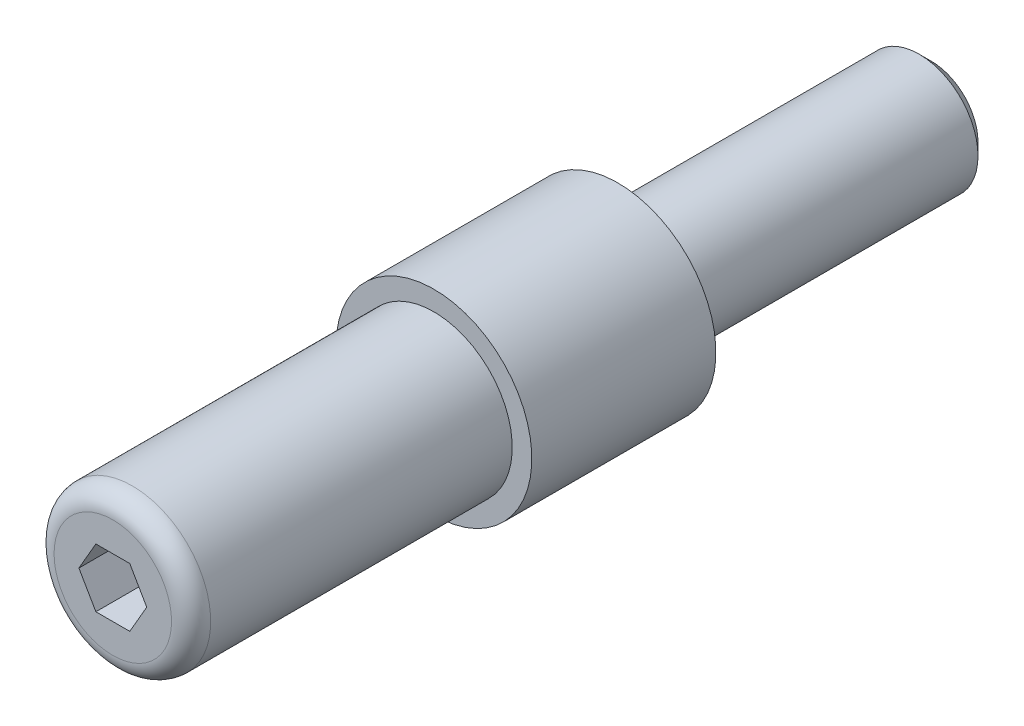
ISO-10303-21;
HEADER;
FILE_DESCRIPTION(('STEP AP214'),'2;1');
FILE_NAME('part.step','',(''),(''),'','','');
FILE_SCHEMA(('AUTOMOTIVE_DESIGN { 1 0 10303 214 1 1 1 1 }'));
ENDSEC;
DATA;
#1=APPLICATION_CONTEXT('core data for automotive mechanical design processes');
#2=APPLICATION_PROTOCOL_DEFINITION('international standard','automotive_design',2000,#1);
#3=PRODUCT_CONTEXT('',#1,'mechanical');
#4=PRODUCT('Part','Part','',(#3));
#5=PRODUCT_RELATED_PRODUCT_CATEGORY('part','',(#4));
#6=PRODUCT_DEFINITION_FORMATION('','',#4);
#7=PRODUCT_DEFINITION_CONTEXT('part definition',#1,'design');
#8=PRODUCT_DEFINITION('design','',#6,#7);
#9=PRODUCT_DEFINITION_SHAPE('','',#8);
#10=(LENGTH_UNIT() NAMED_UNIT(*) SI_UNIT(.MILLI.,.METRE.));
#11=(NAMED_UNIT(*) PLANE_ANGLE_UNIT() SI_UNIT($,.RADIAN.));
#12=(NAMED_UNIT(*) SI_UNIT($,.STERADIAN.) SOLID_ANGLE_UNIT());
#13=UNCERTAINTY_MEASURE_WITH_UNIT(LENGTH_MEASURE(1.E-05),#10,'distance_accuracy_value','');
#14=(GEOMETRIC_REPRESENTATION_CONTEXT(3) GLOBAL_UNCERTAINTY_ASSIGNED_CONTEXT((#13)) GLOBAL_UNIT_ASSIGNED_CONTEXT((#10,
#11,#12)) REPRESENTATION_CONTEXT('',''));
#15=CARTESIAN_POINT('',(0.,0.,0.));
#16=DIRECTION('',(0.,0.,1.));
#17=DIRECTION('',(1.,0.,0.));
#18=AXIS2_PLACEMENT_3D('',#15,#16,#17);
#19=CARTESIAN_POINT('',(0.,-8.80675,-9.));
#20=DIRECTION('',(0.,0.,-1.));
#21=DIRECTION('',(-1.,0.,0.));
#22=AXIS2_PLACEMENT_3D('',#19,#20,#21);
#23=PLANE('',#22);
#24=CARTESIAN_POINT('',(0.,-10.,-9.0000000000714));
#25=DIRECTION('',(0.,0.,1.));
#26=DIRECTION('',(1.,0.,0.));
#27=AXIS2_PLACEMENT_3D('',#24,#25,#26);
#28=CIRCLE('',#27,2.38650000000916);
#29=CARTESIAN_POINT('',(2.38650000000916,-10.,-9.0000000000714));
#30=VERTEX_POINT('',#29);
#31=EDGE_CURVE('E96',#30,#30,#28,.T.);
#32=ORIENTED_EDGE('',*,*,#31,.F.);
#33=EDGE_LOOP('',(#32));
#34=FACE_BOUND('',#33,.T.);
#35=ADVANCED_FACE('F17',(#34),#23,.T.);
#36=CARTESIAN_POINT('',(-1.73205080756888,-10.,35.8));
#37=DIRECTION('',(-0.866025403784439,-0.5,0.));
#38=DIRECTION('',(0.5,-0.866025403784439,0.));
#39=AXIS2_PLACEMENT_3D('',#36,#37,#38);
#40=PLANE('',#39);
#41=DIRECTION('',(0.,0.,-1.));
#42=VECTOR('',#41,1.);
#43=CARTESIAN_POINT('',(-0.866025403784439,-11.5,35.8));
#44=LINE('',#43,#42);
#45=CARTESIAN_POINT('',(-0.86602540378444,-11.5,32.8));
#46=VERTEX_POINT('',#45);
#47=CARTESIAN_POINT('',(-0.86602540378444,-11.5,29.8));
#48=VERTEX_POINT('',#47);
#49=EDGE_CURVE('E93',#46,#48,#44,.T.);
#50=ORIENTED_EDGE('',*,*,#49,.T.);
#51=DIRECTION('',(0.5,-0.866025403784439,0.));
#52=VECTOR('',#51,1.);
#53=CARTESIAN_POINT('',(-1.73205080756888,-10.,29.8));
#54=LINE('',#53,#52);
#55=CARTESIAN_POINT('',(-1.73205080756888,-10.,29.8));
#56=VERTEX_POINT('',#55);
#57=EDGE_CURVE('E82',#56,#48,#54,.T.);
#58=ORIENTED_EDGE('',*,*,#57,.F.);
#59=DIRECTION('',(0.,0.,1.));
#60=VECTOR('',#59,1.);
#61=CARTESIAN_POINT('',(-1.73205080756888,-10.,35.8));
#62=LINE('',#61,#60);
#63=CARTESIAN_POINT('',(-1.73205080756888,-10.,32.8));
#64=VERTEX_POINT('',#63);
#65=EDGE_CURVE('E104',#56,#64,#62,.T.);
#66=ORIENTED_EDGE('',*,*,#65,.T.);
#67=DIRECTION('',(0.5,-0.866025403784439,0.));
#68=VECTOR('',#67,1.);
#69=CARTESIAN_POINT('',(-1.73205080756888,-10.,32.8));
#70=LINE('',#69,#68);
#71=EDGE_CURVE('E77',#46,#64,#70,.F.);
#72=ORIENTED_EDGE('',*,*,#71,.F.);
#73=EDGE_LOOP('',(#50,#58,#66,#72));
#74=FACE_BOUND('',#73,.T.);
#75=ADVANCED_FACE('F94',(#74),#40,.F.);
#76=CARTESIAN_POINT('',(0.,-10.,-8.38649999991503));
#77=DIRECTION('',(0.,0.,1.));
#78=DIRECTION('',(1.,0.,0.));
#79=AXIS2_PLACEMENT_3D('',#76,#77,#78);
#80=CONICAL_SURFACE('',#79,3.00000000010868,0.785398163351121);
#81=CARTESIAN_POINT('',(0.,-10.,-8.3865));
#82=DIRECTION('',(0.,0.,-1.));
#83=DIRECTION('',(-1.,0.,0.));
#84=AXIS2_PLACEMENT_3D('',#81,#82,#83);
#85=CIRCLE('',#84,3.);
#86=CARTESIAN_POINT('',(-3.,-10.,-8.3865));
#87=VERTEX_POINT('',#86);
#88=EDGE_CURVE('E108',#87,#87,#85,.F.);
#89=ORIENTED_EDGE('',*,*,#88,.F.);
#90=EDGE_LOOP('',(#89));
#91=FACE_BOUND('',#90,.T.);
#92=ORIENTED_EDGE('',*,*,#31,.T.);
#93=EDGE_LOOP('',(#92));
#94=FACE_BOUND('',#93,.T.);
#95=ADVANCED_FACE('F325',(#91,#94),#80,.T.);
#96=CARTESIAN_POINT('',(-0.866025403784439,-11.5,35.8));
#97=DIRECTION('',(0.,-1.,0.));
#98=DIRECTION('',(0.,0.,-1.));
#99=AXIS2_PLACEMENT_3D('',#96,#97,#98);
#100=PLANE('',#99);
#101=DIRECTION('',(0.,0.,1.));
#102=VECTOR('',#101,1.);
#103=CARTESIAN_POINT('',(0.866025403784439,-11.5,35.8));
#104=LINE('',#103,#102);
#105=CARTESIAN_POINT('',(0.866025403784439,-11.5,32.8));
#106=VERTEX_POINT('',#105);
#107=CARTESIAN_POINT('',(0.866025403784439,-11.5,29.8));
#108=VERTEX_POINT('',#107);
#109=EDGE_CURVE('E100',#106,#108,#104,.F.);
#110=ORIENTED_EDGE('',*,*,#109,.T.);
#111=DIRECTION('',(1.,0.,0.));
#112=VECTOR('',#111,1.);
#113=CARTESIAN_POINT('',(-0.866025403784439,-11.5,29.8));
#114=LINE('',#113,#112);
#115=EDGE_CURVE('E86',#48,#108,#114,.T.);
#116=ORIENTED_EDGE('',*,*,#115,.F.);
#117=ORIENTED_EDGE('',*,*,#49,.F.);
#118=DIRECTION('',(1.,0.,0.));
#119=VECTOR('',#118,1.);
#120=CARTESIAN_POINT('',(-0.866025403784439,-11.5,32.8));
#121=LINE('',#120,#119);
#122=EDGE_CURVE('E102',#106,#46,#121,.F.);
#123=ORIENTED_EDGE('',*,*,#122,.F.);
#124=EDGE_LOOP('',(#110,#116,#117,#123));
#125=FACE_BOUND('',#124,.T.);
#126=ADVANCED_FACE('F98',(#125),#100,.F.);
#127=CARTESIAN_POINT('',(-0.866025403784439,-8.5,35.8));
#128=DIRECTION('',(-0.866025403784439,0.5,0.));
#129=DIRECTION('',(-0.5,-0.866025403784439,0.));
#130=AXIS2_PLACEMENT_3D('',#127,#128,#129);
#131=PLANE('',#130);
#132=ORIENTED_EDGE('',*,*,#65,.F.);
#133=DIRECTION('',(-0.500000000000001,-0.866025403784438,0.));
#134=VECTOR('',#133,1.);
#135=CARTESIAN_POINT('',(-0.866025403784439,-8.5,29.8));
#136=LINE('',#135,#134);
#137=CARTESIAN_POINT('',(-0.866025403784439,-8.5,29.8));
#138=VERTEX_POINT('',#137);
#139=EDGE_CURVE('E89',#138,#56,#136,.T.);
#140=ORIENTED_EDGE('',*,*,#139,.F.);
#141=DIRECTION('',(0.,0.,1.));
#142=VECTOR('',#141,1.);
#143=CARTESIAN_POINT('',(-0.866025403784439,-8.5,35.8));
#144=LINE('',#143,#142);
#145=CARTESIAN_POINT('',(-0.866025403784439,-8.5,32.8));
#146=VERTEX_POINT('',#145);
#147=EDGE_CURVE('E208',#138,#146,#144,.T.);
#148=ORIENTED_EDGE('',*,*,#147,.T.);
#149=DIRECTION('',(-0.5,-0.866025403784439,0.));
#150=VECTOR('',#149,1.);
#151=CARTESIAN_POINT('',(-0.866025403784439,-8.5,32.8));
#152=LINE('',#151,#150);
#153=EDGE_CURVE('E111',#64,#146,#152,.F.);
#154=ORIENTED_EDGE('',*,*,#153,.F.);
#155=EDGE_LOOP('',(#132,#140,#148,#154));
#156=FACE_BOUND('',#155,.T.);
#157=ADVANCED_FACE('F222',(#156),#131,.F.);
#158=CARTESIAN_POINT('',(0.,-10.,-0.693249999999999));
#159=DIRECTION('',(0.,0.,-1.));
#160=DIRECTION('',(-1.,0.,0.));
#161=AXIS2_PLACEMENT_3D('',#158,#159,#160);
#162=CYLINDRICAL_SURFACE('',#161,3.);
#163=CARTESIAN_POINT('',(0.,-10.,7.));
#164=DIRECTION('',(0.,0.,-1.));
#165=DIRECTION('',(-1.,0.,0.));
#166=AXIS2_PLACEMENT_3D('',#163,#164,#165);
#167=CIRCLE('',#166,3.);
#168=CARTESIAN_POINT('',(-3.,-10.,7.));
#169=VERTEX_POINT('',#168);
#170=EDGE_CURVE('E124',#169,#169,#167,.F.);
#171=ORIENTED_EDGE('',*,*,#170,.F.);
#172=EDGE_LOOP('',(#171));
#173=FACE_BOUND('',#172,.T.);
#174=ORIENTED_EDGE('',*,*,#88,.T.);
#175=EDGE_LOOP('',(#174));
#176=FACE_BOUND('',#175,.T.);
#177=ADVANCED_FACE('F299',(#173,#176),#162,.T.);
#178=CARTESIAN_POINT('',(0.866025403784439,-11.5,35.8));
#179=DIRECTION('',(0.866025403784439,-0.5,0.));
#180=DIRECTION('',(0.5,0.866025403784439,0.));
#181=AXIS2_PLACEMENT_3D('',#178,#179,#180);
#182=PLANE('',#181);
#183=DIRECTION('',(0.,0.,1.));
#184=VECTOR('',#183,1.);
#185=CARTESIAN_POINT('',(1.73205080756888,-10.,35.8));
#186=LINE('',#185,#184);
#187=CARTESIAN_POINT('',(1.73205080756888,-10.,32.8));
#188=VERTEX_POINT('',#187);
#189=CARTESIAN_POINT('',(1.73205080756888,-10.,29.8));
#190=VERTEX_POINT('',#189);
#191=EDGE_CURVE('E127',#188,#190,#186,.F.);
#192=ORIENTED_EDGE('',*,*,#191,.T.);
#193=DIRECTION('',(0.500000000000001,0.866025403784438,0.));
#194=VECTOR('',#193,1.);
#195=CARTESIAN_POINT('',(0.866025403784439,-11.5,29.8));
#196=LINE('',#195,#194);
#197=EDGE_CURVE('E214',#108,#190,#196,.T.);
#198=ORIENTED_EDGE('',*,*,#197,.F.);
#199=ORIENTED_EDGE('',*,*,#109,.F.);
#200=DIRECTION('',(0.5,0.866025403784439,0.));
#201=VECTOR('',#200,1.);
#202=CARTESIAN_POINT('',(0.866025403784439,-11.5,32.8));
#203=LINE('',#202,#201);
#204=EDGE_CURVE('E216',#188,#106,#203,.F.);
#205=ORIENTED_EDGE('',*,*,#204,.F.);
#206=EDGE_LOOP('',(#192,#198,#199,#205));
#207=FACE_BOUND('',#206,.T.);
#208=ADVANCED_FACE('F229',(#207),#182,.F.);
#209=CARTESIAN_POINT('',(0.,-10.,29.8));
#210=DIRECTION('',(0.,0.,1.));
#211=DIRECTION('',(1.,0.,0.));
#212=AXIS2_PLACEMENT_3D('',#209,#210,#211);
#213=PLANE('',#212);
#214=ORIENTED_EDGE('',*,*,#57,.T.);
#215=ORIENTED_EDGE('',*,*,#115,.T.);
#216=ORIENTED_EDGE('',*,*,#197,.T.);
#217=DIRECTION('',(-0.5,0.866025403784439,0.));
#218=VECTOR('',#217,1.);
#219=CARTESIAN_POINT('',(1.73205080756888,-10.,29.8));
#220=LINE('',#219,#218);
#221=CARTESIAN_POINT('',(0.86602540378444,-8.5,29.8));
#222=VERTEX_POINT('',#221);
#223=EDGE_CURVE('E203',#190,#222,#220,.T.);
#224=ORIENTED_EDGE('',*,*,#223,.T.);
#225=DIRECTION('',(1.,0.,0.));
#226=VECTOR('',#225,1.);
#227=CARTESIAN_POINT('',(0.866025403784439,-8.5,29.8));
#228=LINE('',#227,#226);
#229=EDGE_CURVE('E211',#222,#138,#228,.F.);
#230=ORIENTED_EDGE('',*,*,#229,.T.);
#231=ORIENTED_EDGE('',*,*,#139,.T.);
#232=EDGE_LOOP('',(#214,#215,#216,#224,#230,#231));
#233=FACE_BOUND('',#232,.T.);
#234=ADVANCED_FACE('F83',(#233),#213,.T.);
#235=CARTESIAN_POINT('',(0.866025403784439,-8.5,35.8));
#236=DIRECTION('',(0.,1.,0.));
#237=DIRECTION('',(0.,0.,1.));
#238=AXIS2_PLACEMENT_3D('',#235,#236,#237);
#239=PLANE('',#238);
#240=ORIENTED_EDGE('',*,*,#147,.F.);
#241=ORIENTED_EDGE('',*,*,#229,.F.);
#242=DIRECTION('',(0.,0.,1.));
#243=VECTOR('',#242,1.);
#244=CARTESIAN_POINT('',(0.866025403784441,-8.5,35.8));
#245=LINE('',#244,#243);
#246=CARTESIAN_POINT('',(0.86602540378444,-8.5,32.8));
#247=VERTEX_POINT('',#246);
#248=EDGE_CURVE('E123',#222,#247,#245,.T.);
#249=ORIENTED_EDGE('',*,*,#248,.T.);
#250=DIRECTION('',(1.,0.,0.));
#251=VECTOR('',#250,1.);
#252=CARTESIAN_POINT('',(0.866025403784439,-8.5,32.8));
#253=LINE('',#252,#251);
#254=EDGE_CURVE('E128',#146,#247,#253,.T.);
#255=ORIENTED_EDGE('',*,*,#254,.F.);
#256=EDGE_LOOP('',(#240,#241,#249,#255));
#257=FACE_BOUND('',#256,.T.);
#258=ADVANCED_FACE('F236',(#257),#239,.F.);
#259=CARTESIAN_POINT('',(0.,-6.,7.));
#260=DIRECTION('',(0.,0.,-1.));
#261=DIRECTION('',(-1.,0.,0.));
#262=AXIS2_PLACEMENT_3D('',#259,#260,#261);
#263=PLANE('',#262);
#264=ORIENTED_EDGE('',*,*,#170,.T.);
#265=EDGE_LOOP('',(#264));
#266=FACE_BOUND('',#265,.T.);
#267=CARTESIAN_POINT('',(0.,-10.,7.));
#268=DIRECTION('',(0.,0.,-1.));
#269=DIRECTION('',(-1.,0.,0.));
#270=AXIS2_PLACEMENT_3D('',#267,#268,#269);
#271=CIRCLE('',#270,5.);
#272=CARTESIAN_POINT('',(-5.,-10.,7.));
#273=VERTEX_POINT('',#272);
#274=EDGE_CURVE('E120',#273,#273,#271,.F.);
#275=ORIENTED_EDGE('',*,*,#274,.F.);
#276=EDGE_LOOP('',(#275));
#277=FACE_BOUND('',#276,.T.);
#278=ADVANCED_FACE('F238',(#266,#277),#263,.T.);
#279=CARTESIAN_POINT('',(1.73205080756888,-10.,35.8));
#280=DIRECTION('',(0.866025403784439,0.5,0.));
#281=DIRECTION('',(-0.5,0.866025403784439,0.));
#282=AXIS2_PLACEMENT_3D('',#279,#280,#281);
#283=PLANE('',#282);
#284=ORIENTED_EDGE('',*,*,#248,.F.);
#285=ORIENTED_EDGE('',*,*,#223,.F.);
#286=ORIENTED_EDGE('',*,*,#191,.F.);
#287=DIRECTION('',(0.500000000000001,-0.866025403784438,0.));
#288=VECTOR('',#287,1.);
#289=CARTESIAN_POINT('',(0.866025403784439,-8.5,32.8));
#290=LINE('',#289,#288);
#291=EDGE_CURVE('E119',#247,#188,#290,.T.);
#292=ORIENTED_EDGE('',*,*,#291,.F.);
#293=EDGE_LOOP('',(#284,#285,#286,#292));
#294=FACE_BOUND('',#293,.T.);
#295=ADVANCED_FACE('F234',(#294),#283,.F.);
#296=CARTESIAN_POINT('',(0.,-10.,11.7));
#297=DIRECTION('',(0.,0.,-1.));
#298=DIRECTION('',(-1.,0.,0.));
#299=AXIS2_PLACEMENT_3D('',#296,#297,#298);
#300=CYLINDRICAL_SURFACE('',#299,5.);
#301=CARTESIAN_POINT('',(0.,-10.,16.4));
#302=DIRECTION('',(0.,0.,-1.));
#303=DIRECTION('',(-1.,0.,0.));
#304=AXIS2_PLACEMENT_3D('',#301,#302,#303);
#305=CIRCLE('',#304,5.);
#306=CARTESIAN_POINT('',(-5.,-10.,16.4));
#307=VERTEX_POINT('',#306);
#308=EDGE_CURVE('E115',#307,#307,#305,.F.);
#309=ORIENTED_EDGE('',*,*,#308,.F.);
#310=EDGE_LOOP('',(#309));
#311=FACE_BOUND('',#310,.T.);
#312=ORIENTED_EDGE('',*,*,#274,.T.);
#313=EDGE_LOOP('',(#312));
#314=FACE_BOUND('',#313,.T.);
#315=ADVANCED_FACE('F156',(#311,#314),#300,.T.);
#316=CARTESIAN_POINT('',(0.,-8.5,32.8));
#317=DIRECTION('',(0.,0.,1.));
#318=DIRECTION('',(0.,-1.,0.));
#319=AXIS2_PLACEMENT_3D('',#316,#317,#318);
#320=PLANE('',#319);
#321=CARTESIAN_POINT('',(0.,-10.,32.8));
#322=DIRECTION('',(0.,0.,-1.));
#323=DIRECTION('',(1.,0.,0.));
#324=AXIS2_PLACEMENT_3D('',#321,#322,#323);
#325=CIRCLE('',#324,3.);
#326=CARTESIAN_POINT('',(3.,-10.,32.8));
#327=VERTEX_POINT('',#326);
#328=CARTESIAN_POINT('',(-3.,-10.,32.8));
#329=VERTEX_POINT('',#328);
#330=EDGE_CURVE('E118',#327,#329,#325,.T.);
#331=ORIENTED_EDGE('',*,*,#330,.F.);
#332=CARTESIAN_POINT('',(0.,-10.,32.8));
#333=DIRECTION('',(0.,0.,-1.));
#334=DIRECTION('',(0.,1.,0.));
#335=AXIS2_PLACEMENT_3D('',#332,#333,#334);
#336=CIRCLE('',#335,3.);
#337=CARTESIAN_POINT('',(0.,-7.,32.8));
#338=VERTEX_POINT('',#337);
#339=EDGE_CURVE('E37',#338,#327,#336,.T.);
#340=ORIENTED_EDGE('',*,*,#339,.F.);
#341=CARTESIAN_POINT('',(0.,-10.,32.8));
#342=DIRECTION('',(0.,0.,-1.));
#343=DIRECTION('',(-1.,0.,0.));
#344=AXIS2_PLACEMENT_3D('',#341,#342,#343);
#345=CIRCLE('',#344,3.);
#346=EDGE_CURVE('E132',#329,#338,#345,.T.);
#347=ORIENTED_EDGE('',*,*,#346,.F.);
#348=EDGE_LOOP('',(#331,#340,#347));
#349=FACE_BOUND('',#348,.T.);
#350=ORIENTED_EDGE('',*,*,#254,.T.);
#351=ORIENTED_EDGE('',*,*,#291,.T.);
#352=ORIENTED_EDGE('',*,*,#204,.T.);
#353=ORIENTED_EDGE('',*,*,#122,.T.);
#354=ORIENTED_EDGE('',*,*,#71,.T.);
#355=ORIENTED_EDGE('',*,*,#153,.T.);
#356=EDGE_LOOP('',(#350,#351,#352,#353,#354,#355));
#357=FACE_BOUND('',#356,.T.);
#358=ADVANCED_FACE('F137',(#349,#357),#320,.T.);
#359=CARTESIAN_POINT('',(0.,-5.5,16.4));
#360=DIRECTION('',(0.,0.,1.));
#361=DIRECTION('',(0.,-1.,0.));
#362=AXIS2_PLACEMENT_3D('',#359,#360,#361);
#363=PLANE('',#362);
#364=ORIENTED_EDGE('',*,*,#308,.T.);
#365=EDGE_LOOP('',(#364));
#366=FACE_BOUND('',#365,.T.);
#367=CARTESIAN_POINT('',(0.,-10.,16.4));
#368=DIRECTION('',(0.,0.,-1.));
#369=DIRECTION('',(-1.,0.,0.));
#370=AXIS2_PLACEMENT_3D('',#367,#368,#369);
#371=CIRCLE('',#370,4.);
#372=CARTESIAN_POINT('',(-4.,-10.,16.4));
#373=VERTEX_POINT('',#372);
#374=EDGE_CURVE('E28',#373,#373,#371,.F.);
#375=ORIENTED_EDGE('',*,*,#374,.F.);
#376=EDGE_LOOP('',(#375));
#377=FACE_BOUND('',#376,.T.);
#378=ADVANCED_FACE('F155',(#366,#377),#363,.T.);
#379=CARTESIAN_POINT('',(0.,-10.,31.8));
#380=DIRECTION('',(0.,0.,1.));
#381=DIRECTION('',(1.,0.,0.));
#382=AXIS2_PLACEMENT_3D('',#379,#380,#381);
#383=TOROIDAL_SURFACE('',#382,3.,1.);
#384=CARTESIAN_POINT('',(0.,-10.,31.8));
#385=DIRECTION('',(0.,0.,-1.));
#386=DIRECTION('',(-1.,0.,0.));
#387=AXIS2_PLACEMENT_3D('',#384,#385,#386);
#388=CIRCLE('',#387,4.);
#389=CARTESIAN_POINT('',(-4.,-10.,31.8));
#390=VERTEX_POINT('',#389);
#391=EDGE_CURVE('E11',#390,#390,#388,.T.);
#392=ORIENTED_EDGE('',*,*,#391,.F.);
#393=EDGE_LOOP('',(#392));
#394=FACE_BOUND('',#393,.T.);
#395=ORIENTED_EDGE('',*,*,#346,.T.);
#396=ORIENTED_EDGE('',*,*,#339,.T.);
#397=ORIENTED_EDGE('',*,*,#330,.T.);
#398=EDGE_LOOP('',(#395,#396,#397));
#399=FACE_BOUND('',#398,.T.);
#400=ADVANCED_FACE('F131',(#394,#399),#383,.T.);
#401=CARTESIAN_POINT('',(0.,-10.,24.1));
#402=DIRECTION('',(0.,0.,-1.));
#403=DIRECTION('',(-1.,0.,0.));
#404=AXIS2_PLACEMENT_3D('',#401,#402,#403);
#405=CYLINDRICAL_SURFACE('',#404,4.);
#406=ORIENTED_EDGE('',*,*,#374,.T.);
#407=EDGE_LOOP('',(#406));
#408=FACE_BOUND('',#407,.T.);
#409=ORIENTED_EDGE('',*,*,#391,.T.);
#410=EDGE_LOOP('',(#409));
#411=FACE_BOUND('',#410,.T.);
#412=ADVANCED_FACE('F189',(#408,#411),#405,.T.);
#413=CLOSED_SHELL('',(#35,#75,#95,#126,#157,#177,#208,#234,#258,#278,#295,#315,#358,#378,#400,#412));
#414=MANIFOLD_SOLID_BREP('B1',#413);
#415=ADVANCED_BREP_SHAPE_REPRESENTATION('',(#18,#414),#14);
#416=SHAPE_DEFINITION_REPRESENTATION(#9,#415);
ENDSEC;
END-ISO-10303-21;
